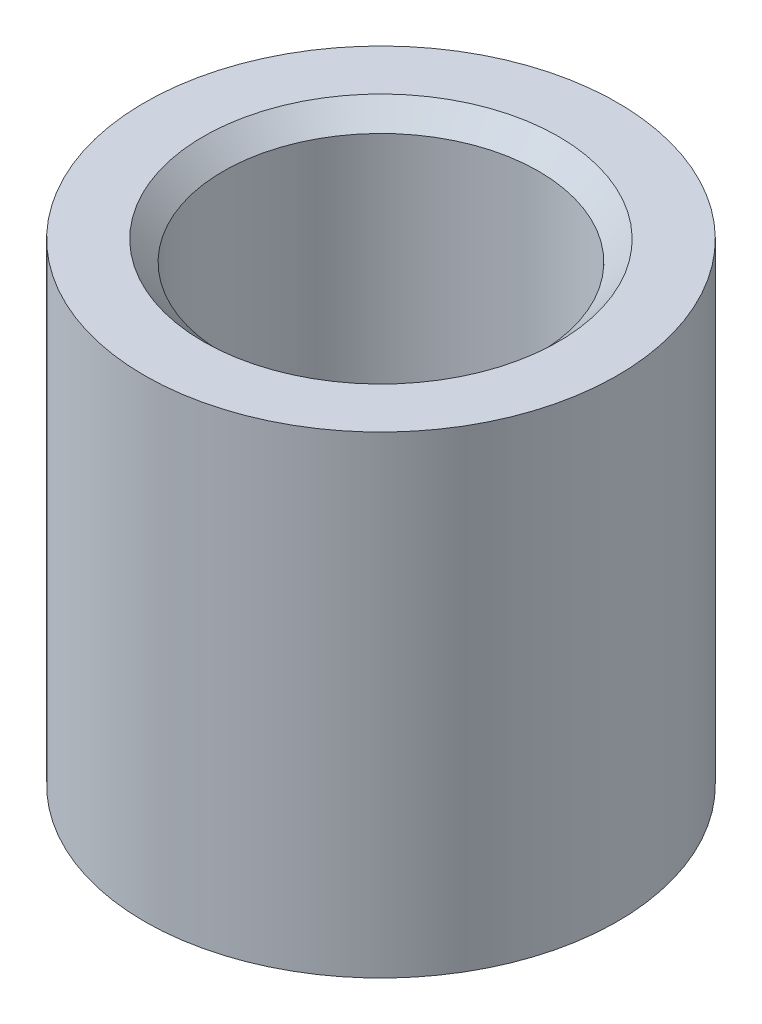
ISO-10303-21;
HEADER;
FILE_DESCRIPTION(('STEP AP214'),'2;1');
FILE_NAME('part.step','',(''),(''),'','','');
FILE_SCHEMA(('AUTOMOTIVE_DESIGN { 1 0 10303 214 1 1 1 1 }'));
ENDSEC;
DATA;
#1=APPLICATION_CONTEXT('core data for automotive mechanical design processes');
#2=APPLICATION_PROTOCOL_DEFINITION('international standard','automotive_design',2000,#1);
#3=PRODUCT_CONTEXT('',#1,'mechanical');
#4=PRODUCT('Part','Part','',(#3));
#5=PRODUCT_RELATED_PRODUCT_CATEGORY('part','',(#4));
#6=PRODUCT_DEFINITION_FORMATION('','',#4);
#7=PRODUCT_DEFINITION_CONTEXT('part definition',#1,'design');
#8=PRODUCT_DEFINITION('design','',#6,#7);
#9=PRODUCT_DEFINITION_SHAPE('','',#8);
#10=(LENGTH_UNIT() NAMED_UNIT(*) SI_UNIT(.MILLI.,.METRE.));
#11=(NAMED_UNIT(*) PLANE_ANGLE_UNIT() SI_UNIT($,.RADIAN.));
#12=(NAMED_UNIT(*) SI_UNIT($,.STERADIAN.) SOLID_ANGLE_UNIT());
#13=UNCERTAINTY_MEASURE_WITH_UNIT(LENGTH_MEASURE(1.E-05),#10,'distance_accuracy_value','');
#14=(GEOMETRIC_REPRESENTATION_CONTEXT(3) GLOBAL_UNCERTAINTY_ASSIGNED_CONTEXT((#13)) GLOBAL_UNIT_ASSIGNED_CONTEXT((#10,
#11,#12)) REPRESENTATION_CONTEXT('',''));
#15=CARTESIAN_POINT('',(0.,0.,0.));
#16=DIRECTION('',(0.,0.,1.));
#17=DIRECTION('',(1.,0.,0.));
#18=AXIS2_PLACEMENT_3D('',#15,#16,#17);
#19=CARTESIAN_POINT('',(0.,6.,0.));
#20=DIRECTION('',(0.,-1.,0.));
#21=DIRECTION('',(0.,0.,-1.));
#22=AXIS2_PLACEMENT_3D('',#19,#20,#21);
#23=CYLINDRICAL_SURFACE('',#22,2.);
#24=CARTESIAN_POINT('',(0.,5.746,0.));
#25=DIRECTION('',(0.,1.,0.));
#26=DIRECTION('',(0.,0.,1.));
#27=AXIS2_PLACEMENT_3D('',#24,#25,#26);
#28=CIRCLE('',#27,2.);
#29=CARTESIAN_POINT('',(0.,5.746,2.));
#30=VERTEX_POINT('',#29);
#31=EDGE_CURVE('E56',#30,#30,#28,.T.);
#32=ORIENTED_EDGE('',*,*,#31,.T.);
#33=EDGE_LOOP('',(#32));
#34=FACE_BOUND('',#33,.T.);
#35=CARTESIAN_POINT('',(0.,0.254,0.));
#36=DIRECTION('',(0.,-1.,0.));
#37=DIRECTION('',(0.,0.,-1.));
#38=AXIS2_PLACEMENT_3D('',#35,#36,#37);
#39=CIRCLE('',#38,2.);
#40=CARTESIAN_POINT('',(0.,0.254,-2.));
#41=VERTEX_POINT('',#40);
#42=EDGE_CURVE('E65',#41,#41,#39,.F.);
#43=ORIENTED_EDGE('',*,*,#42,.F.);
#44=EDGE_LOOP('',(#43));
#45=FACE_BOUND('',#44,.T.);
#46=ADVANCED_FACE('F43',(#34,#45),#23,.F.);
#47=CARTESIAN_POINT('',(0.,6.,0.));
#48=DIRECTION('',(0.,1.,0.));
#49=DIRECTION('',(0.,0.,1.));
#50=AXIS2_PLACEMENT_3D('',#47,#48,#49);
#51=PLANE('',#50);
#52=CARTESIAN_POINT('',(0.,6.,0.));
#53=DIRECTION('',(0.,1.,0.));
#54=DIRECTION('',(0.,0.,1.));
#55=AXIS2_PLACEMENT_3D('',#52,#53,#54);
#56=CIRCLE('',#55,2.254);
#57=CARTESIAN_POINT('',(0.,6.,2.254));
#58=VERTEX_POINT('',#57);
#59=EDGE_CURVE('E61',#58,#58,#56,.T.);
#60=ORIENTED_EDGE('',*,*,#59,.F.);
#61=EDGE_LOOP('',(#60));
#62=FACE_BOUND('',#61,.T.);
#63=CARTESIAN_POINT('',(0.,6.,0.));
#64=DIRECTION('',(0.,1.,0.));
#65=DIRECTION('',(0.,0.,1.));
#66=AXIS2_PLACEMENT_3D('',#63,#64,#65);
#67=CIRCLE('',#66,3.);
#68=CARTESIAN_POINT('',(0.,6.,3.));
#69=VERTEX_POINT('',#68);
#70=EDGE_CURVE('E10',#69,#69,#67,.T.);
#71=ORIENTED_EDGE('',*,*,#70,.T.);
#72=EDGE_LOOP('',(#71));
#73=FACE_BOUND('',#72,.T.);
#74=ADVANCED_FACE('F89',(#62,#73),#51,.T.);
#75=CARTESIAN_POINT('',(0.,0.,0.));
#76=DIRECTION('',(0.,1.,0.));
#77=DIRECTION('',(0.,0.,1.));
#78=AXIS2_PLACEMENT_3D('',#75,#76,#77);
#79=PLANE('',#78);
#80=CARTESIAN_POINT('',(0.,0.,0.));
#81=DIRECTION('',(0.,1.,0.));
#82=DIRECTION('',(0.,0.,1.));
#83=AXIS2_PLACEMENT_3D('',#80,#81,#82);
#84=CIRCLE('',#83,2.254);
#85=CARTESIAN_POINT('',(0.,0.,2.254));
#86=VERTEX_POINT('',#85);
#87=EDGE_CURVE('E69',#86,#86,#84,.T.);
#88=ORIENTED_EDGE('',*,*,#87,.T.);
#89=EDGE_LOOP('',(#88));
#90=FACE_BOUND('',#89,.T.);
#91=CARTESIAN_POINT('',(0.,0.,0.));
#92=DIRECTION('',(0.,1.,0.));
#93=DIRECTION('',(0.,0.,1.));
#94=AXIS2_PLACEMENT_3D('',#91,#92,#93);
#95=CIRCLE('',#94,3.);
#96=CARTESIAN_POINT('',(0.,0.,3.));
#97=VERTEX_POINT('',#96);
#98=EDGE_CURVE('E47',#97,#97,#95,.T.);
#99=ORIENTED_EDGE('',*,*,#98,.F.);
#100=EDGE_LOOP('',(#99));
#101=FACE_BOUND('',#100,.T.);
#102=ADVANCED_FACE('F74',(#90,#101),#79,.F.);
#103=CARTESIAN_POINT('',(0.,6.,0.));
#104=DIRECTION('',(0.,-1.,0.));
#105=DIRECTION('',(0.,0.,-1.));
#106=AXIS2_PLACEMENT_3D('',#103,#104,#105);
#107=CYLINDRICAL_SURFACE('',#106,3.);
#108=ORIENTED_EDGE('',*,*,#70,.F.);
#109=EDGE_LOOP('',(#108));
#110=FACE_BOUND('',#109,.T.);
#111=ORIENTED_EDGE('',*,*,#98,.T.);
#112=EDGE_LOOP('',(#111));
#113=FACE_BOUND('',#112,.T.);
#114=ADVANCED_FACE('F45',(#110,#113),#107,.T.);
#115=CARTESIAN_POINT('',(0.,6.,0.));
#116=DIRECTION('',(0.,1.,0.));
#117=DIRECTION('',(0.,0.,1.));
#118=AXIS2_PLACEMENT_3D('',#115,#116,#117);
#119=CONICAL_SURFACE('',#118,2.254,0.785398163397449);
#120=ORIENTED_EDGE('',*,*,#31,.F.);
#121=EDGE_LOOP('',(#120));
#122=FACE_BOUND('',#121,.T.);
#123=ORIENTED_EDGE('',*,*,#59,.T.);
#124=EDGE_LOOP('',(#123));
#125=FACE_BOUND('',#124,.T.);
#126=ADVANCED_FACE('F79',(#122,#125),#119,.F.);
#127=CARTESIAN_POINT('',(0.,0.,0.));
#128=DIRECTION('',(0.,-1.,0.));
#129=DIRECTION('',(0.,0.,1.));
#130=AXIS2_PLACEMENT_3D('',#127,#128,#129);
#131=CONICAL_SURFACE('',#130,2.254,0.785398163397449);
#132=ORIENTED_EDGE('',*,*,#42,.T.);
#133=EDGE_LOOP('',(#132));
#134=FACE_BOUND('',#133,.T.);
#135=ORIENTED_EDGE('',*,*,#87,.F.);
#136=EDGE_LOOP('',(#135));
#137=FACE_BOUND('',#136,.T.);
#138=ADVANCED_FACE('F77',(#134,#137),#131,.F.);
#139=CLOSED_SHELL('',(#46,#74,#102,#114,#126,#138));
#140=MANIFOLD_SOLID_BREP('B2',#139);
#141=ADVANCED_BREP_SHAPE_REPRESENTATION('',(#18,#140),#14);
#142=SHAPE_DEFINITION_REPRESENTATION(#9,#141);
ENDSEC;
END-ISO-10303-21;
